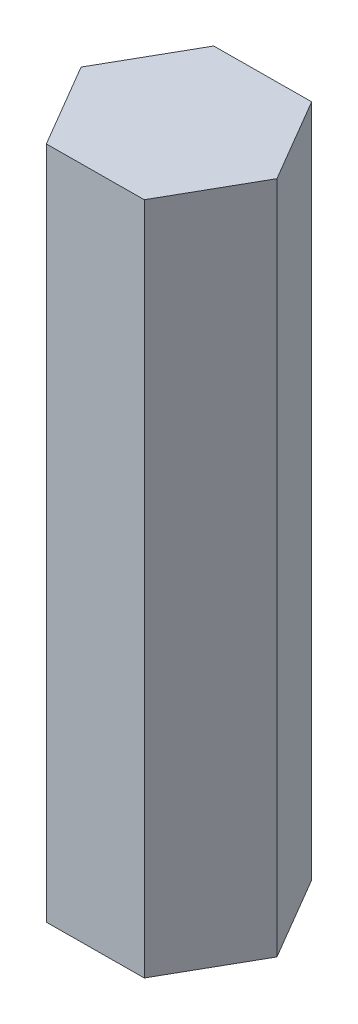
ISO-10303-21;
HEADER;
FILE_DESCRIPTION(('STEP AP214'),'2;1');
FILE_NAME('part.step','',(''),(''),'','','');
FILE_SCHEMA(('AUTOMOTIVE_DESIGN { 1 0 10303 214 1 1 1 1 }'));
ENDSEC;
DATA;
#1=APPLICATION_CONTEXT('core data for automotive mechanical design processes');
#2=APPLICATION_PROTOCOL_DEFINITION('international standard','automotive_design',2000,#1);
#3=PRODUCT_CONTEXT('',#1,'mechanical');
#4=PRODUCT('Part','Part','',(#3));
#5=PRODUCT_RELATED_PRODUCT_CATEGORY('part','',(#4));
#6=PRODUCT_DEFINITION_FORMATION('','',#4);
#7=PRODUCT_DEFINITION_CONTEXT('part definition',#1,'design');
#8=PRODUCT_DEFINITION('design','',#6,#7);
#9=PRODUCT_DEFINITION_SHAPE('','',#8);
#10=(LENGTH_UNIT() NAMED_UNIT(*) SI_UNIT(.MILLI.,.METRE.));
#11=(NAMED_UNIT(*) PLANE_ANGLE_UNIT() SI_UNIT($,.RADIAN.));
#12=(NAMED_UNIT(*) SI_UNIT($,.STERADIAN.) SOLID_ANGLE_UNIT());
#13=UNCERTAINTY_MEASURE_WITH_UNIT(LENGTH_MEASURE(1.E-05),#10,'distance_accuracy_value','');
#14=(GEOMETRIC_REPRESENTATION_CONTEXT(3) GLOBAL_UNCERTAINTY_ASSIGNED_CONTEXT((#13)) GLOBAL_UNIT_ASSIGNED_CONTEXT((#10,
#11,#12)) REPRESENTATION_CONTEXT('',''));
#15=CARTESIAN_POINT('',(0.,0.,0.));
#16=DIRECTION('',(0.,0.,1.));
#17=DIRECTION('',(1.,0.,0.));
#18=AXIS2_PLACEMENT_3D('',#15,#16,#17);
#19=CARTESIAN_POINT('',(7.33219032223841,50.8,-0.0481498889585002));
#20=DIRECTION('',(-0.862723343018122,0.,0.505676214006191));
#21=DIRECTION('',(0.505676214006191,0.,0.862723343018123));
#22=AXIS2_PLACEMENT_3D('',#19,#20,#21);
#23=PLANE('',#22);
#24=DIRECTION('',(-0.505676214006191,0.,-0.862723343018123));
#25=VECTOR('',#24,1.);
#26=CARTESIAN_POINT('',(7.33219032223841,0.,-0.0481498889585002));
#27=LINE('',#26,#25);
#28=CARTESIAN_POINT('',(7.33219032223841,0.,-0.0481498889585002));
#29=VERTEX_POINT('',#28);
#30=CARTESIAN_POINT('',(3.62439613409175,0.,-6.37393802892012));
#31=VERTEX_POINT('',#30);
#32=EDGE_CURVE('E121',#29,#31,#27,.T.);
#33=ORIENTED_EDGE('',*,*,#32,.T.);
#34=DIRECTION('',(0.,-1.,0.));
#35=VECTOR('',#34,1.);
#36=CARTESIAN_POINT('',(3.62439613409175,50.8,-6.37393802892012));
#37=LINE('',#36,#35);
#38=CARTESIAN_POINT('',(3.62439613409175,50.8,-6.37393802892012));
#39=VERTEX_POINT('',#38);
#40=EDGE_CURVE('E11',#39,#31,#37,.T.);
#41=ORIENTED_EDGE('',*,*,#40,.F.);
#42=DIRECTION('',(-0.505676214006191,0.,-0.862723343018123));
#43=VECTOR('',#42,1.);
#44=CARTESIAN_POINT('',(7.33219032223841,50.8,-0.0481498889585002));
#45=LINE('',#44,#43);
#46=CARTESIAN_POINT('',(7.33219032223841,50.8,-0.0481498889585002));
#47=VERTEX_POINT('',#46);
#48=EDGE_CURVE('E131',#47,#39,#45,.T.);
#49=ORIENTED_EDGE('',*,*,#48,.F.);
#50=DIRECTION('',(0.,-1.,0.));
#51=VECTOR('',#50,1.);
#52=CARTESIAN_POINT('',(7.33219032223841,50.8,-0.0481498889585002));
#53=LINE('',#52,#51);
#54=EDGE_CURVE('E117',#47,#29,#53,.T.);
#55=ORIENTED_EDGE('',*,*,#54,.T.);
#56=EDGE_LOOP('',(#33,#41,#49,#55));
#57=FACE_BOUND('',#56,.T.);
#58=ADVANCED_FACE('F37',(#57),#23,.F.);
#59=CARTESIAN_POINT('',(3.62439613409175,50.8,-6.37393802892012));
#60=DIRECTION('',(0.00656677590983583,0.,0.999978438494626));
#61=DIRECTION('',(0.999978438494626,0.,-0.00656677590983583));
#62=AXIS2_PLACEMENT_3D('',#59,#60,#61);
#63=PLANE('',#62);
#64=DIRECTION('',(-0.999978438494626,0.,0.00656677590983583));
#65=VECTOR('',#64,1.);
#66=CARTESIAN_POINT('',(3.62439613409175,0.,-6.37393802892012));
#67=LINE('',#66,#65);
#68=CARTESIAN_POINT('',(-3.70779418814666,0.,-6.32578813996162));
#69=VERTEX_POINT('',#68);
#70=EDGE_CURVE('E124',#31,#69,#67,.T.);
#71=ORIENTED_EDGE('',*,*,#70,.T.);
#72=DIRECTION('',(0.,-1.,0.));
#73=VECTOR('',#72,1.);
#74=CARTESIAN_POINT('',(-3.70779418814666,50.8,-6.32578813996162));
#75=LINE('',#74,#73);
#76=CARTESIAN_POINT('',(-3.70779418814666,50.8,-6.32578813996162));
#77=VERTEX_POINT('',#76);
#78=EDGE_CURVE('E45',#77,#69,#75,.T.);
#79=ORIENTED_EDGE('',*,*,#78,.F.);
#80=DIRECTION('',(-0.999978438494626,0.,0.00656677590983583));
#81=VECTOR('',#80,1.);
#82=CARTESIAN_POINT('',(3.62439613409175,50.8,-6.37393802892012));
#83=LINE('',#82,#81);
#84=EDGE_CURVE('E90',#39,#77,#83,.T.);
#85=ORIENTED_EDGE('',*,*,#84,.F.);
#86=ORIENTED_EDGE('',*,*,#40,.T.);
#87=EDGE_LOOP('',(#71,#79,#85,#86));
#88=FACE_BOUND('',#87,.T.);
#89=ADVANCED_FACE('F155',(#88),#63,.F.);
#90=CARTESIAN_POINT('',(-3.70779418814666,50.8,-6.32578813996162));
#91=DIRECTION('',(0.869290118927959,0.,0.494302224488435));
#92=DIRECTION('',(0.494302224488435,0.,-0.869290118927959));
#93=AXIS2_PLACEMENT_3D('',#90,#91,#92);
#94=PLANE('',#93);
#95=DIRECTION('',(-0.494302224488435,0.,0.869290118927959));
#96=VECTOR('',#95,1.);
#97=CARTESIAN_POINT('',(-3.70779418814666,0.,-6.32578813996162));
#98=LINE('',#97,#96);
#99=CARTESIAN_POINT('',(-7.33219032223841,0.,0.0481498889585011));
#100=VERTEX_POINT('',#99);
#101=EDGE_CURVE('E126',#69,#100,#98,.T.);
#102=ORIENTED_EDGE('',*,*,#101,.T.);
#103=DIRECTION('',(0.,-1.,0.));
#104=VECTOR('',#103,1.);
#105=CARTESIAN_POINT('',(-7.33219032223841,50.8,0.0481498889585011));
#106=LINE('',#105,#104);
#107=CARTESIAN_POINT('',(-7.33219032223841,50.8,0.0481498889585011));
#108=VERTEX_POINT('',#107);
#109=EDGE_CURVE('E112',#108,#100,#106,.T.);
#110=ORIENTED_EDGE('',*,*,#109,.F.);
#111=DIRECTION('',(-0.494302224488435,0.,0.869290118927959));
#112=VECTOR('',#111,1.);
#113=CARTESIAN_POINT('',(-3.70779418814666,50.8,-6.32578813996162));
#114=LINE('',#113,#112);
#115=EDGE_CURVE('E103',#77,#108,#114,.T.);
#116=ORIENTED_EDGE('',*,*,#115,.F.);
#117=ORIENTED_EDGE('',*,*,#78,.T.);
#118=EDGE_LOOP('',(#102,#110,#116,#117));
#119=FACE_BOUND('',#118,.T.);
#120=ADVANCED_FACE('F137',(#119),#94,.F.);
#121=CARTESIAN_POINT('',(-7.33219032223841,50.8,0.0481498889585011));
#122=DIRECTION('',(0.862723343018123,0.,-0.505676214006191));
#123=DIRECTION('',(-0.505676214006191,0.,-0.862723343018123));
#124=AXIS2_PLACEMENT_3D('',#121,#122,#123);
#125=PLANE('',#124);
#126=DIRECTION('',(0.505676214006191,0.,0.862723343018122));
#127=VECTOR('',#126,1.);
#128=CARTESIAN_POINT('',(-7.33219032223841,0.,0.0481498889585011));
#129=LINE('',#128,#127);
#130=CARTESIAN_POINT('',(-3.62439613409174,0.,6.37393802892012));
#131=VERTEX_POINT('',#130);
#132=EDGE_CURVE('E111',#100,#131,#129,.T.);
#133=ORIENTED_EDGE('',*,*,#132,.T.);
#134=DIRECTION('',(0.,-1.,0.));
#135=VECTOR('',#134,1.);
#136=CARTESIAN_POINT('',(-3.62439613409174,50.8,6.37393802892012));
#137=LINE('',#136,#135);
#138=CARTESIAN_POINT('',(-3.62439613409174,50.8,6.37393802892012));
#139=VERTEX_POINT('',#138);
#140=EDGE_CURVE('E108',#139,#131,#137,.T.);
#141=ORIENTED_EDGE('',*,*,#140,.F.);
#142=DIRECTION('',(0.505676214006191,0.,0.862723343018122));
#143=VECTOR('',#142,1.);
#144=CARTESIAN_POINT('',(-7.33219032223841,50.8,0.0481498889585011));
#145=LINE('',#144,#143);
#146=EDGE_CURVE('E97',#108,#139,#145,.T.);
#147=ORIENTED_EDGE('',*,*,#146,.F.);
#148=ORIENTED_EDGE('',*,*,#109,.T.);
#149=EDGE_LOOP('',(#133,#141,#147,#148));
#150=FACE_BOUND('',#149,.T.);
#151=ADVANCED_FACE('F109',(#150),#125,.F.);
#152=CARTESIAN_POINT('',(-3.62439613409174,50.8,6.37393802892012));
#153=DIRECTION('',(-0.00656677590983631,0.,-0.999978438494626));
#154=DIRECTION('',(-0.999978438494626,0.,0.00656677590983631));
#155=AXIS2_PLACEMENT_3D('',#152,#153,#154);
#156=PLANE('',#155);
#157=DIRECTION('',(0.999978438494626,0.,-0.00656677590983631));
#158=VECTOR('',#157,1.);
#159=CARTESIAN_POINT('',(-3.62439613409174,0.,6.37393802892012));
#160=LINE('',#159,#158);
#161=CARTESIAN_POINT('',(3.70779418814666,0.,6.32578813996162));
#162=VERTEX_POINT('',#161);
#163=EDGE_CURVE('E76',#131,#162,#160,.T.);
#164=ORIENTED_EDGE('',*,*,#163,.T.);
#165=DIRECTION('',(0.,-1.,0.));
#166=VECTOR('',#165,1.);
#167=CARTESIAN_POINT('',(3.70779418814666,50.8,6.32578813996162));
#168=LINE('',#167,#166);
#169=CARTESIAN_POINT('',(3.70779418814666,50.8,6.32578813996162));
#170=VERTEX_POINT('',#169);
#171=EDGE_CURVE('E113',#170,#162,#168,.T.);
#172=ORIENTED_EDGE('',*,*,#171,.F.);
#173=DIRECTION('',(0.999978438494626,0.,-0.00656677590983631));
#174=VECTOR('',#173,1.);
#175=CARTESIAN_POINT('',(-3.62439613409174,50.8,6.37393802892012));
#176=LINE('',#175,#174);
#177=EDGE_CURVE('E101',#139,#170,#176,.T.);
#178=ORIENTED_EDGE('',*,*,#177,.F.);
#179=ORIENTED_EDGE('',*,*,#140,.T.);
#180=EDGE_LOOP('',(#164,#172,#178,#179));
#181=FACE_BOUND('',#180,.T.);
#182=ADVANCED_FACE('F115',(#181),#156,.F.);
#183=CARTESIAN_POINT('',(3.70779418814666,50.8,6.32578813996162));
#184=DIRECTION('',(-0.869290118927958,0.,-0.494302224488436));
#185=DIRECTION('',(-0.494302224488436,0.,0.869290118927958));
#186=AXIS2_PLACEMENT_3D('',#183,#184,#185);
#187=PLANE('',#186);
#188=DIRECTION('',(0.494302224488436,0.,-0.869290118927958));
#189=VECTOR('',#188,1.);
#190=CARTESIAN_POINT('',(3.70779418814666,0.,6.32578813996162));
#191=LINE('',#190,#189);
#192=EDGE_CURVE('E82',#162,#29,#191,.T.);
#193=ORIENTED_EDGE('',*,*,#192,.T.);
#194=ORIENTED_EDGE('',*,*,#54,.F.);
#195=DIRECTION('',(0.494302224488436,0.,-0.869290118927958));
#196=VECTOR('',#195,1.);
#197=CARTESIAN_POINT('',(3.70779418814666,50.8,6.32578813996162));
#198=LINE('',#197,#196);
#199=EDGE_CURVE('E53',#170,#47,#198,.T.);
#200=ORIENTED_EDGE('',*,*,#199,.F.);
#201=ORIENTED_EDGE('',*,*,#171,.T.);
#202=EDGE_LOOP('',(#193,#194,#200,#201));
#203=FACE_BOUND('',#202,.T.);
#204=ADVANCED_FACE('F144',(#203),#187,.F.);
#205=CARTESIAN_POINT('',(0.,50.8,0.));
#206=DIRECTION('',(0.,1.,0.));
#207=DIRECTION('',(0.,0.,1.));
#208=AXIS2_PLACEMENT_3D('',#205,#206,#207);
#209=PLANE('',#208);
#210=ORIENTED_EDGE('',*,*,#48,.T.);
#211=ORIENTED_EDGE('',*,*,#84,.T.);
#212=ORIENTED_EDGE('',*,*,#115,.T.);
#213=ORIENTED_EDGE('',*,*,#146,.T.);
#214=ORIENTED_EDGE('',*,*,#177,.T.);
#215=ORIENTED_EDGE('',*,*,#199,.T.);
#216=EDGE_LOOP('',(#210,#211,#212,#213,#214,#215));
#217=FACE_BOUND('',#216,.T.);
#218=ADVANCED_FACE('F99',(#217),#209,.T.);
#219=CARTESIAN_POINT('',(0.,0.,0.));
#220=DIRECTION('',(0.,1.,0.));
#221=DIRECTION('',(0.,0.,1.));
#222=AXIS2_PLACEMENT_3D('',#219,#220,#221);
#223=PLANE('',#222);
#224=ORIENTED_EDGE('',*,*,#32,.F.);
#225=ORIENTED_EDGE('',*,*,#192,.F.);
#226=ORIENTED_EDGE('',*,*,#163,.F.);
#227=ORIENTED_EDGE('',*,*,#132,.F.);
#228=ORIENTED_EDGE('',*,*,#101,.F.);
#229=ORIENTED_EDGE('',*,*,#70,.F.);
#230=EDGE_LOOP('',(#224,#225,#226,#227,#228,#229));
#231=FACE_BOUND('',#230,.T.);
#232=ADVANCED_FACE('F140',(#231),#223,.F.);
#233=CLOSED_SHELL('',(#58,#89,#120,#151,#182,#204,#218,#232));
#234=MANIFOLD_SOLID_BREP('B2',#233);
#235=ADVANCED_BREP_SHAPE_REPRESENTATION('',(#18,#234),#14);
#236=SHAPE_DEFINITION_REPRESENTATION(#9,#235);
ENDSEC;
END-ISO-10303-21;
